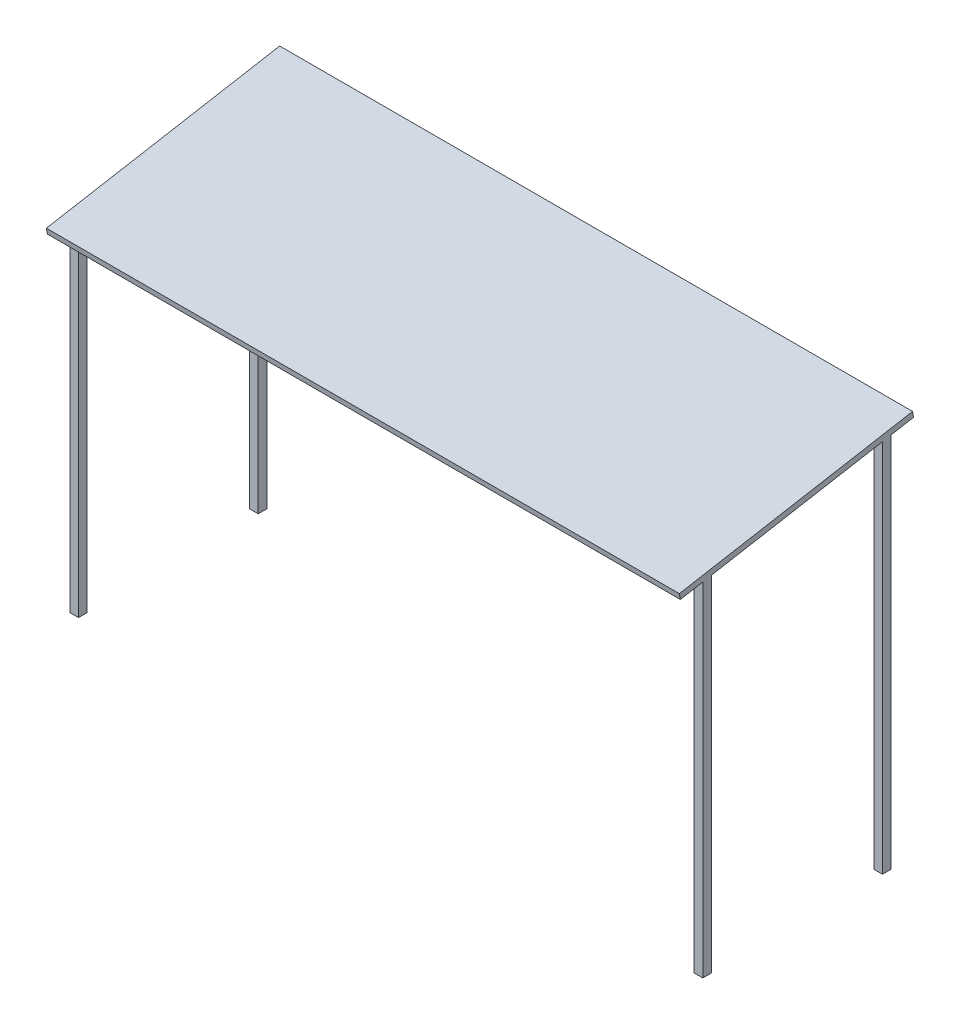
ISO-10303-21;
HEADER;
FILE_DESCRIPTION(('STEP AP214'),'2;1');
FILE_NAME('part.step','',(''),(''),'','','');
FILE_SCHEMA(('AUTOMOTIVE_DESIGN { 1 0 10303 214 1 1 1 1 }'));
ENDSEC;
DATA;
#1=APPLICATION_CONTEXT('core data for automotive mechanical design processes');
#2=APPLICATION_PROTOCOL_DEFINITION('international standard','automotive_design',2000,#1);
#3=PRODUCT_CONTEXT('',#1,'mechanical');
#4=PRODUCT('Part','Part','',(#3));
#5=PRODUCT_RELATED_PRODUCT_CATEGORY('part','',(#4));
#6=PRODUCT_DEFINITION_FORMATION('','',#4);
#7=PRODUCT_DEFINITION_CONTEXT('part definition',#1,'design');
#8=PRODUCT_DEFINITION('design','',#6,#7);
#9=PRODUCT_DEFINITION_SHAPE('','',#8);
#10=(LENGTH_UNIT() NAMED_UNIT(*) SI_UNIT(.MILLI.,.METRE.));
#11=(NAMED_UNIT(*) PLANE_ANGLE_UNIT() SI_UNIT($,.RADIAN.));
#12=(NAMED_UNIT(*) SI_UNIT($,.STERADIAN.) SOLID_ANGLE_UNIT());
#13=UNCERTAINTY_MEASURE_WITH_UNIT(LENGTH_MEASURE(1.E-05),#10,'distance_accuracy_value','');
#14=(GEOMETRIC_REPRESENTATION_CONTEXT(3) GLOBAL_UNCERTAINTY_ASSIGNED_CONTEXT((#13)) GLOBAL_UNIT_ASSIGNED_CONTEXT((#10,
#11,#12)) REPRESENTATION_CONTEXT('',''));
#15=CARTESIAN_POINT('',(0.,0.,0.));
#16=DIRECTION('',(0.,0.,1.));
#17=DIRECTION('',(1.,0.,0.));
#18=AXIS2_PLACEMENT_3D('',#15,#16,#17);
#19=CARTESIAN_POINT('',(7647.9187393404,3008.63729707734,1652.4));
#20=DIRECTION('',(0.,-0.984807753012208,-0.173648177666927));
#21=DIRECTION('',(0.,0.173648177666927,-0.984807753012209));
#22=AXIS2_PLACEMENT_3D('',#19,#20,#21);
#23=PLANE('',#22);
#24=DIRECTION('',(-1.,0.,0.));
#25=VECTOR('',#24,1.);
#26=CARTESIAN_POINT('',(0.,3008.63729707734,1652.4));
#27=LINE('',#26,#25);
#28=CARTESIAN_POINT('',(5552.4,3008.63729707734,1652.4));
#29=VERTEX_POINT('',#28);
#30=CARTESIAN_POINT('',(2.02360637091109E-13,3008.63729707734,1652.4));
#31=VERTEX_POINT('',#30);
#32=EDGE_CURVE('E202',#29,#31,#27,.T.);
#33=ORIENTED_EDGE('',*,*,#32,.F.);
#34=DIRECTION('',(0.,0.173648177666927,-0.984807753012209));
#35=VECTOR('',#34,1.);
#36=CARTESIAN_POINT('',(5552.4,3008.63729707734,1652.4));
#37=LINE('',#36,#35);
#38=CARTESIAN_POINT('',(5552.4,2973.90766154395,1849.36155060244));
#39=VERTEX_POINT('',#38);
#40=EDGE_CURVE('E275',#39,#29,#37,.T.);
#41=ORIENTED_EDGE('',*,*,#40,.F.);
#42=DIRECTION('',(-1.,0.,0.));
#43=VECTOR('',#42,1.);
#44=CARTESIAN_POINT('',(7647.9187393404,2973.90766154395,1849.36155060244));
#45=LINE('',#44,#43);
#46=CARTESIAN_POINT('',(2.26481470341147E-13,2973.90766154395,1849.36155060244));
#47=VERTEX_POINT('',#46);
#48=EDGE_CURVE('E267',#39,#47,#45,.T.);
#49=ORIENTED_EDGE('',*,*,#48,.T.);
#50=DIRECTION('',(0.,-0.173648177666927,0.984807753012208));
#51=VECTOR('',#50,1.);
#52=CARTESIAN_POINT('',(2.02360637091109E-13,3008.63729707734,1652.4));
#53=LINE('',#52,#51);
#54=EDGE_CURVE('E245',#31,#47,#53,.T.);
#55=ORIENTED_EDGE('',*,*,#54,.F.);
#56=EDGE_LOOP('',(#33,#41,#49,#55));
#57=FACE_BOUND('',#56,.T.);
#58=ADVANCED_FACE('F35',(#57),#23,.T.);
#59=CARTESIAN_POINT('',(5552.4,3022.07341300732,1576.2));
#60=VERTEX_POINT('',#59);
#61=CARTESIAN_POINT('',(5552.4,3286.56388407002,76.1999999999993));
#62=VERTEX_POINT('',#61);
#63=EDGE_CURVE('E279',#60,#62,#37,.T.);
#64=ORIENTED_EDGE('',*,*,#63,.F.);
#65=DIRECTION('',(1.,0.,0.));
#66=VECTOR('',#65,1.);
#67=CARTESIAN_POINT('',(0.,3022.07341300732,1576.2));
#68=LINE('',#67,#66);
#69=CARTESIAN_POINT('',(0.,3022.07341300732,1576.2));
#70=VERTEX_POINT('',#69);
#71=EDGE_CURVE('E195',#70,#60,#68,.T.);
#72=ORIENTED_EDGE('',*,*,#71,.F.);
#73=CARTESIAN_POINT('',(0.,3286.56388407002,76.2000000000005));
#74=VERTEX_POINT('',#73);
#75=EDGE_CURVE('E258',#74,#70,#53,.T.);
#76=ORIENTED_EDGE('',*,*,#75,.F.);
#77=DIRECTION('',(-1.,0.,0.));
#78=VECTOR('',#77,1.);
#79=CARTESIAN_POINT('',(0.,3286.56388407002,76.2));
#80=LINE('',#79,#78);
#81=EDGE_CURVE('E278',#62,#74,#80,.T.);
#82=ORIENTED_EDGE('',*,*,#81,.F.);
#83=EDGE_LOOP('',(#64,#72,#76,#82));
#84=FACE_BOUND('',#83,.T.);
#85=ADVANCED_FACE('F375',(#84),#23,.T.);
#86=CARTESIAN_POINT('',(76.2,3300.,1652.4));
#87=DIRECTION('',(-1.,0.,0.));
#88=DIRECTION('',(0.,0.,1.));
#89=AXIS2_PLACEMENT_3D('',#86,#87,#88);
#90=PLANE('',#89);
#91=DIRECTION('',(0.,0.,-1.));
#92=VECTOR('',#91,1.);
#93=CARTESIAN_POINT('',(76.2,2945.87341300732,1576.2));
#94=LINE('',#93,#92);
#95=CARTESIAN_POINT('',(76.2,2945.87341300732,1652.4));
#96=VERTEX_POINT('',#95);
#97=CARTESIAN_POINT('',(76.2,2945.87341300732,1576.2));
#98=VERTEX_POINT('',#97);
#99=EDGE_CURVE('E176',#96,#98,#94,.T.);
#100=ORIENTED_EDGE('',*,*,#99,.F.);
#101=DIRECTION('',(0.,-1.,0.));
#102=VECTOR('',#101,1.);
#103=CARTESIAN_POINT('',(76.2,3300.,1652.4));
#104=LINE('',#103,#102);
#105=CARTESIAN_POINT('',(76.2,0.,1652.4));
#106=VERTEX_POINT('',#105);
#107=EDGE_CURVE('E223',#96,#106,#104,.T.);
#108=ORIENTED_EDGE('',*,*,#107,.T.);
#109=DIRECTION('',(0.,0.,-1.));
#110=VECTOR('',#109,1.);
#111=CARTESIAN_POINT('',(76.2,0.,1652.4));
#112=LINE('',#111,#110);
#113=CARTESIAN_POINT('',(76.2,0.,1576.2));
#114=VERTEX_POINT('',#113);
#115=EDGE_CURVE('E208',#106,#114,#112,.T.);
#116=ORIENTED_EDGE('',*,*,#115,.T.);
#117=DIRECTION('',(0.,-1.,0.));
#118=VECTOR('',#117,1.);
#119=CARTESIAN_POINT('',(76.2,3300.,1576.2));
#120=LINE('',#119,#118);
#121=EDGE_CURVE('E221',#98,#114,#120,.T.);
#122=ORIENTED_EDGE('',*,*,#121,.F.);
#123=EDGE_LOOP('',(#100,#108,#116,#122));
#124=FACE_BOUND('',#123,.T.);
#125=ADVANCED_FACE('F381',(#124),#90,.F.);
#126=CARTESIAN_POINT('',(5476.2,3300.,1652.4));
#127=DIRECTION('',(1.,0.,0.));
#128=DIRECTION('',(0.,0.,-1.));
#129=AXIS2_PLACEMENT_3D('',#126,#127,#128);
#130=PLANE('',#129);
#131=DIRECTION('',(0.,0.,-1.));
#132=VECTOR('',#131,1.);
#133=CARTESIAN_POINT('',(5476.2,2945.87341300732,1576.2));
#134=LINE('',#133,#132);
#135=CARTESIAN_POINT('',(5476.2,2945.87341300732,1652.4));
#136=VERTEX_POINT('',#135);
#137=CARTESIAN_POINT('',(5476.2,2945.87341300732,1576.2));
#138=VERTEX_POINT('',#137);
#139=EDGE_CURVE('E173',#136,#138,#134,.T.);
#140=ORIENTED_EDGE('',*,*,#139,.T.);
#141=DIRECTION('',(0.,-1.,0.));
#142=VECTOR('',#141,1.);
#143=CARTESIAN_POINT('',(5476.2,3300.,1576.2));
#144=LINE('',#143,#142);
#145=CARTESIAN_POINT('',(5476.2,0.,1576.2));
#146=VERTEX_POINT('',#145);
#147=EDGE_CURVE('E184',#138,#146,#144,.T.);
#148=ORIENTED_EDGE('',*,*,#147,.T.);
#149=DIRECTION('',(0.,0.,1.));
#150=VECTOR('',#149,1.);
#151=CARTESIAN_POINT('',(5476.2,0.,1652.4));
#152=LINE('',#151,#150);
#153=CARTESIAN_POINT('',(5476.2,0.,1652.4));
#154=VERTEX_POINT('',#153);
#155=EDGE_CURVE('E350',#146,#154,#152,.T.);
#156=ORIENTED_EDGE('',*,*,#155,.T.);
#157=DIRECTION('',(0.,-1.,0.));
#158=VECTOR('',#157,1.);
#159=CARTESIAN_POINT('',(5476.2,3300.,1652.4));
#160=LINE('',#159,#158);
#161=EDGE_CURVE('E186',#136,#154,#160,.T.);
#162=ORIENTED_EDGE('',*,*,#161,.F.);
#163=EDGE_LOOP('',(#140,#148,#156,#162));
#164=FACE_BOUND('',#163,.T.);
#165=ADVANCED_FACE('F182',(#164),#130,.F.);
#166=CARTESIAN_POINT('',(5552.4,3300.,-4.44089209850063E-13));
#167=VERTEX_POINT('',#166);
#168=CARTESIAN_POINT('',(5552.4,3334.72963553339,-196.961550602443));
#169=VERTEX_POINT('',#168);
#170=EDGE_CURVE('E253',#167,#169,#37,.T.);
#171=ORIENTED_EDGE('',*,*,#170,.F.);
#172=DIRECTION('',(-1.,0.,0.));
#173=VECTOR('',#172,1.);
#174=CARTESIAN_POINT('',(0.,3300.,0.));
#175=LINE('',#174,#173);
#176=CARTESIAN_POINT('',(0.,3300.,0.));
#177=VERTEX_POINT('',#176);
#178=EDGE_CURVE('E283',#167,#177,#175,.T.);
#179=ORIENTED_EDGE('',*,*,#178,.T.);
#180=CARTESIAN_POINT('',(0.,3334.72963553339,-196.961550602442));
#181=VERTEX_POINT('',#180);
#182=EDGE_CURVE('E254',#181,#177,#53,.T.);
#183=ORIENTED_EDGE('',*,*,#182,.F.);
#184=DIRECTION('',(-1.,0.,0.));
#185=VECTOR('',#184,1.);
#186=CARTESIAN_POINT('',(7647.9187393404,3334.72963553339,-196.961550602443));
#187=LINE('',#186,#185);
#188=EDGE_CURVE('E249',#169,#181,#187,.T.);
#189=ORIENTED_EDGE('',*,*,#188,.F.);
#190=EDGE_LOOP('',(#171,#179,#183,#189));
#191=FACE_BOUND('',#190,.T.);
#192=ADVANCED_FACE('F323',(#191),#23,.T.);
#193=CARTESIAN_POINT('',(0.,3300.,0.));
#194=DIRECTION('',(1.,0.,0.));
#195=DIRECTION('',(0.,0.,-1.));
#196=AXIS2_PLACEMENT_3D('',#193,#194,#195);
#197=PLANE('',#196);
#198=DIRECTION('',(0.,-1.,0.));
#199=VECTOR('',#198,1.);
#200=CARTESIAN_POINT('',(0.,3300.,76.2));
#201=LINE('',#200,#199);
#202=CARTESIAN_POINT('',(0.,0.,76.2));
#203=VERTEX_POINT('',#202);
#204=EDGE_CURVE('E11',#74,#203,#201,.T.);
#205=ORIENTED_EDGE('',*,*,#204,.F.);
#206=ORIENTED_EDGE('',*,*,#75,.T.);
#207=DIRECTION('',(0.,-1.,0.));
#208=VECTOR('',#207,1.);
#209=CARTESIAN_POINT('',(0.,3300.,1576.2));
#210=LINE('',#209,#208);
#211=CARTESIAN_POINT('',(0.,0.,1576.2));
#212=VERTEX_POINT('',#211);
#213=EDGE_CURVE('E219',#70,#212,#210,.T.);
#214=ORIENTED_EDGE('',*,*,#213,.T.);
#215=DIRECTION('',(0.,0.,1.));
#216=VECTOR('',#215,1.);
#217=CARTESIAN_POINT('',(0.,0.,1652.4));
#218=LINE('',#217,#216);
#219=CARTESIAN_POINT('',(0.,0.,1652.4));
#220=VERTEX_POINT('',#219);
#221=EDGE_CURVE('E214',#212,#220,#218,.T.);
#222=ORIENTED_EDGE('',*,*,#221,.T.);
#223=DIRECTION('',(0.,-1.,0.));
#224=VECTOR('',#223,1.);
#225=CARTESIAN_POINT('',(0.,3300.,1652.4));
#226=LINE('',#225,#224);
#227=EDGE_CURVE('E217',#31,#220,#226,.T.);
#228=ORIENTED_EDGE('',*,*,#227,.F.);
#229=ORIENTED_EDGE('',*,*,#54,.T.);
#230=DIRECTION('',(0.,0.984807753012208,0.173648177666927));
#231=VECTOR('',#230,1.);
#232=CARTESIAN_POINT('',(2.26481470341147E-13,2973.90766154395,1849.36155060244));
#233=LINE('',#232,#231);
#234=CARTESIAN_POINT('',(2.27544758765935E-13,3023.14804919456,1858.04395948579));
#235=VERTEX_POINT('',#234);
#236=EDGE_CURVE('E257',#47,#235,#233,.T.);
#237=ORIENTED_EDGE('',*,*,#236,.T.);
#238=DIRECTION('',(0.,0.173648177666927,-0.984807753012209));
#239=VECTOR('',#238,1.);
#240=CARTESIAN_POINT('',(0.,3349.24038765061,8.68240888334636));
#241=LINE('',#240,#239);
#242=CARTESIAN_POINT('',(0.,3383.970023184,-188.279141719095));
#243=VERTEX_POINT('',#242);
#244=EDGE_CURVE('E261',#235,#243,#241,.T.);
#245=ORIENTED_EDGE('',*,*,#244,.T.);
#246=DIRECTION('',(0.,-0.984807753012209,-0.173648177666926));
#247=VECTOR('',#246,1.);
#248=CARTESIAN_POINT('',(0.,3334.72963553339,-196.961550602442));
#249=LINE('',#248,#247);
#250=EDGE_CURVE('E264',#243,#181,#249,.T.);
#251=ORIENTED_EDGE('',*,*,#250,.T.);
#252=ORIENTED_EDGE('',*,*,#182,.T.);
#253=DIRECTION('',(0.,-1.,0.));
#254=VECTOR('',#253,1.);
#255=CARTESIAN_POINT('',(0.,3300.,0.));
#256=LINE('',#255,#254);
#257=CARTESIAN_POINT('',(0.,0.,0.));
#258=VERTEX_POINT('',#257);
#259=EDGE_CURVE('E286',#177,#258,#256,.T.);
#260=ORIENTED_EDGE('',*,*,#259,.T.);
#261=DIRECTION('',(0.,0.,1.));
#262=VECTOR('',#261,1.);
#263=CARTESIAN_POINT('',(0.,0.,0.));
#264=LINE('',#263,#262);
#265=EDGE_CURVE('E282',#258,#203,#264,.T.);
#266=ORIENTED_EDGE('',*,*,#265,.T.);
#267=EDGE_LOOP('',(#205,#206,#214,#222,#228,#229,#237,#245,#251,#252,#260,#266));
#268=FACE_BOUND('',#267,.T.);
#269=ADVANCED_FACE('F37',(#268),#197,.F.);
#270=CARTESIAN_POINT('',(0.,3300.,76.2));
#271=DIRECTION('',(0.,0.,-1.));
#272=DIRECTION('',(-1.,0.,0.));
#273=AXIS2_PLACEMENT_3D('',#270,#271,#272);
#274=PLANE('',#273);
#275=DIRECTION('',(0.,-1.,0.));
#276=VECTOR('',#275,1.);
#277=CARTESIAN_POINT('',(76.2,3300.,76.2));
#278=LINE('',#277,#276);
#279=CARTESIAN_POINT('',(76.2,3223.8,76.2));
#280=VERTEX_POINT('',#279);
#281=CARTESIAN_POINT('',(76.2,0.,76.2));
#282=VERTEX_POINT('',#281);
#283=EDGE_CURVE('E43',#280,#282,#278,.T.);
#284=ORIENTED_EDGE('',*,*,#283,.F.);
#285=DIRECTION('',(1.,0.,0.));
#286=VECTOR('',#285,1.);
#287=CARTESIAN_POINT('',(5476.2,3223.8,76.1999999999992));
#288=LINE('',#287,#286);
#289=CARTESIAN_POINT('',(5476.2,3223.8,76.1999999999993));
#290=VERTEX_POINT('',#289);
#291=EDGE_CURVE('E341',#280,#290,#288,.T.);
#292=ORIENTED_EDGE('',*,*,#291,.T.);
#293=DIRECTION('',(0.,-1.,0.));
#294=VECTOR('',#293,1.);
#295=CARTESIAN_POINT('',(5476.2,3300.,76.1999999999993));
#296=LINE('',#295,#294);
#297=CARTESIAN_POINT('',(5476.2,0.,76.1999999999993));
#298=VERTEX_POINT('',#297);
#299=EDGE_CURVE('E241',#290,#298,#296,.T.);
#300=ORIENTED_EDGE('',*,*,#299,.T.);
#301=DIRECTION('',(1.,0.,0.));
#302=VECTOR('',#301,1.);
#303=CARTESIAN_POINT('',(5552.4,0.,76.1999999999993));
#304=LINE('',#303,#302);
#305=CARTESIAN_POINT('',(5552.4,0.,76.1999999999993));
#306=VERTEX_POINT('',#305);
#307=EDGE_CURVE('E231',#298,#306,#304,.T.);
#308=ORIENTED_EDGE('',*,*,#307,.T.);
#309=DIRECTION('',(0.,-1.,0.));
#310=VECTOR('',#309,1.);
#311=CARTESIAN_POINT('',(5552.4,3300.,76.1999999999993));
#312=LINE('',#311,#310);
#313=EDGE_CURVE('E239',#62,#306,#312,.T.);
#314=ORIENTED_EDGE('',*,*,#313,.F.);
#315=ORIENTED_EDGE('',*,*,#81,.T.);
#316=ORIENTED_EDGE('',*,*,#204,.T.);
#317=DIRECTION('',(1.,0.,0.));
#318=VECTOR('',#317,1.);
#319=CARTESIAN_POINT('',(0.,0.,76.2));
#320=LINE('',#319,#318);
#321=EDGE_CURVE('E290',#203,#282,#320,.T.);
#322=ORIENTED_EDGE('',*,*,#321,.T.);
#323=EDGE_LOOP('',(#284,#292,#300,#308,#314,#315,#316,#322));
#324=FACE_BOUND('',#323,.T.);
#325=ADVANCED_FACE('F310',(#324),#274,.F.);
#326=CARTESIAN_POINT('',(76.2,3300.,0.));
#327=DIRECTION('',(-1.,0.,0.));
#328=DIRECTION('',(0.,0.,1.));
#329=AXIS2_PLACEMENT_3D('',#326,#327,#328);
#330=PLANE('',#329);
#331=DIRECTION('',(0.,-1.,0.));
#332=VECTOR('',#331,1.);
#333=CARTESIAN_POINT('',(76.2,3300.,0.));
#334=LINE('',#333,#332);
#335=CARTESIAN_POINT('',(76.2,3223.8,0.));
#336=VERTEX_POINT('',#335);
#337=CARTESIAN_POINT('',(76.2,0.,0.));
#338=VERTEX_POINT('',#337);
#339=EDGE_CURVE('E299',#336,#338,#334,.T.);
#340=ORIENTED_EDGE('',*,*,#339,.F.);
#341=DIRECTION('',(0.,0.,-1.));
#342=VECTOR('',#341,1.);
#343=CARTESIAN_POINT('',(76.2,3223.8,5476.73760657215));
#344=LINE('',#343,#342);
#345=EDGE_CURVE('E307',#280,#336,#344,.T.);
#346=ORIENTED_EDGE('',*,*,#345,.F.);
#347=ORIENTED_EDGE('',*,*,#283,.T.);
#348=DIRECTION('',(0.,0.,-1.));
#349=VECTOR('',#348,1.);
#350=CARTESIAN_POINT('',(76.2,0.,0.));
#351=LINE('',#350,#349);
#352=EDGE_CURVE('E293',#282,#338,#351,.T.);
#353=ORIENTED_EDGE('',*,*,#352,.T.);
#354=EDGE_LOOP('',(#340,#346,#347,#353));
#355=FACE_BOUND('',#354,.T.);
#356=ADVANCED_FACE('F304',(#355),#330,.F.);
#357=CARTESIAN_POINT('',(0.,3300.,0.));
#358=DIRECTION('',(0.,0.,1.));
#359=DIRECTION('',(1.,0.,0.));
#360=AXIS2_PLACEMENT_3D('',#357,#358,#359);
#361=PLANE('',#360);
#362=DIRECTION('',(-1.,0.,0.));
#363=VECTOR('',#362,1.);
#364=CARTESIAN_POINT('',(0.,0.,0.));
#365=LINE('',#364,#363);
#366=EDGE_CURVE('E287',#338,#258,#365,.T.);
#367=ORIENTED_EDGE('',*,*,#366,.T.);
#368=ORIENTED_EDGE('',*,*,#259,.F.);
#369=ORIENTED_EDGE('',*,*,#178,.F.);
#370=DIRECTION('',(0.,-1.,0.));
#371=VECTOR('',#370,1.);
#372=CARTESIAN_POINT('',(5552.4,3300.,-6.79972888758576E-13));
#373=LINE('',#372,#371);
#374=CARTESIAN_POINT('',(5552.4,0.,-6.79972888758576E-13));
#375=VERTEX_POINT('',#374);
#376=EDGE_CURVE('E236',#167,#375,#373,.T.);
#377=ORIENTED_EDGE('',*,*,#376,.T.);
#378=DIRECTION('',(-1.,0.,0.));
#379=VECTOR('',#378,1.);
#380=CARTESIAN_POINT('',(5552.4,0.,-6.79972888758576E-13));
#381=LINE('',#380,#379);
#382=CARTESIAN_POINT('',(5476.2,0.,-6.61309271539571E-13));
#383=VERTEX_POINT('',#382);
#384=EDGE_CURVE('E225',#375,#383,#381,.T.);
#385=ORIENTED_EDGE('',*,*,#384,.T.);
#386=DIRECTION('',(0.,-1.,0.));
#387=VECTOR('',#386,1.);
#388=CARTESIAN_POINT('',(5476.2,3300.,-6.61309271539571E-13));
#389=LINE('',#388,#387);
#390=CARTESIAN_POINT('',(5476.2,3223.8,0.));
#391=VERTEX_POINT('',#390);
#392=EDGE_CURVE('E243',#391,#383,#389,.T.);
#393=ORIENTED_EDGE('',*,*,#392,.F.);
#394=DIRECTION('',(-1.,0.,0.));
#395=VECTOR('',#394,1.);
#396=CARTESIAN_POINT('',(5476.2,3223.8,0.));
#397=LINE('',#396,#395);
#398=EDGE_CURVE('E187',#391,#336,#397,.T.);
#399=ORIENTED_EDGE('',*,*,#398,.T.);
#400=ORIENTED_EDGE('',*,*,#339,.T.);
#401=EDGE_LOOP('',(#367,#368,#369,#377,#385,#393,#399,#400));
#402=FACE_BOUND('',#401,.T.);
#403=ADVANCED_FACE('F315',(#402),#361,.F.);
#404=CARTESIAN_POINT('',(0.,0.,0.));
#405=DIRECTION('',(0.,1.,0.));
#406=DIRECTION('',(0.,0.,1.));
#407=AXIS2_PLACEMENT_3D('',#404,#405,#406);
#408=PLANE('',#407);
#409=ORIENTED_EDGE('',*,*,#265,.F.);
#410=ORIENTED_EDGE('',*,*,#366,.F.);
#411=ORIENTED_EDGE('',*,*,#352,.F.);
#412=ORIENTED_EDGE('',*,*,#321,.F.);
#413=EDGE_LOOP('',(#409,#410,#411,#412));
#414=FACE_BOUND('',#413,.T.);
#415=ADVANCED_FACE('F313',(#414),#408,.F.);
#416=CARTESIAN_POINT('',(7647.9187393404,3334.72963553339,-196.961550602443));
#417=DIRECTION('',(0.,0.173648177666926,-0.984807753012209));
#418=DIRECTION('',(0.,0.984807753012209,0.173648177666926));
#419=AXIS2_PLACEMENT_3D('',#416,#417,#418);
#420=PLANE('',#419);
#421=DIRECTION('',(0.,0.984807753012209,0.173648177666926));
#422=VECTOR('',#421,1.);
#423=CARTESIAN_POINT('',(5552.4,3334.72963553339,-196.961550602442));
#424=LINE('',#423,#422);
#425=CARTESIAN_POINT('',(5552.4,3383.970023184,-188.279141719096));
#426=VERTEX_POINT('',#425);
#427=EDGE_CURVE('E251',#169,#426,#424,.T.);
#428=ORIENTED_EDGE('',*,*,#427,.F.);
#429=ORIENTED_EDGE('',*,*,#188,.T.);
#430=ORIENTED_EDGE('',*,*,#250,.F.);
#431=DIRECTION('',(-1.,0.,0.));
#432=VECTOR('',#431,1.);
#433=CARTESIAN_POINT('',(7647.9187393404,3383.970023184,-188.279141719096));
#434=LINE('',#433,#432);
#435=EDGE_CURVE('E269',#426,#243,#434,.T.);
#436=ORIENTED_EDGE('',*,*,#435,.F.);
#437=EDGE_LOOP('',(#428,#429,#430,#436));
#438=FACE_BOUND('',#437,.T.);
#439=ADVANCED_FACE('F407',(#438),#420,.T.);
#440=CARTESIAN_POINT('',(7647.9187393404,3349.24038765061,8.68240888334542));
#441=DIRECTION('',(0.,0.984807753012209,0.173648177666927));
#442=DIRECTION('',(0.,-0.173648177666927,0.984807753012209));
#443=AXIS2_PLACEMENT_3D('',#440,#441,#442);
#444=PLANE('',#443);
#445=DIRECTION('',(0.,-0.173648177666927,0.984807753012209));
#446=VECTOR('',#445,1.);
#447=CARTESIAN_POINT('',(5552.4,3349.24038765061,8.68240888334543));
#448=LINE('',#447,#446);
#449=CARTESIAN_POINT('',(5552.4,3023.14804919456,1858.04395948579));
#450=VERTEX_POINT('',#449);
#451=EDGE_CURVE('E248',#426,#450,#448,.T.);
#452=ORIENTED_EDGE('',*,*,#451,.F.);
#453=ORIENTED_EDGE('',*,*,#435,.T.);
#454=ORIENTED_EDGE('',*,*,#244,.F.);
#455=DIRECTION('',(-1.,0.,0.));
#456=VECTOR('',#455,1.);
#457=CARTESIAN_POINT('',(7647.9187393404,3023.14804919456,1858.04395948579));
#458=LINE('',#457,#456);
#459=EDGE_CURVE('E271',#450,#235,#458,.T.);
#460=ORIENTED_EDGE('',*,*,#459,.F.);
#461=EDGE_LOOP('',(#452,#453,#454,#460));
#462=FACE_BOUND('',#461,.T.);
#463=ADVANCED_FACE('F410',(#462),#444,.T.);
#464=CARTESIAN_POINT('',(7647.9187393404,2973.90766154395,1849.36155060244));
#465=DIRECTION('',(0.,-0.173648177666927,0.984807753012208));
#466=DIRECTION('',(0.,-0.984807753012209,-0.173648177666927));
#467=AXIS2_PLACEMENT_3D('',#464,#465,#466);
#468=PLANE('',#467);
#469=DIRECTION('',(0.,-0.984807753012209,-0.173648177666927));
#470=VECTOR('',#469,1.);
#471=CARTESIAN_POINT('',(5552.4,2973.90766154395,1849.36155060244));
#472=LINE('',#471,#470);
#473=EDGE_CURVE('E246',#450,#39,#472,.T.);
#474=ORIENTED_EDGE('',*,*,#473,.F.);
#475=ORIENTED_EDGE('',*,*,#459,.T.);
#476=ORIENTED_EDGE('',*,*,#236,.F.);
#477=ORIENTED_EDGE('',*,*,#48,.F.);
#478=EDGE_LOOP('',(#474,#475,#476,#477));
#479=FACE_BOUND('',#478,.T.);
#480=ADVANCED_FACE('F406',(#479),#468,.T.);
#481=CARTESIAN_POINT('',(5552.4,3300.,-6.79972888758576E-13));
#482=DIRECTION('',(-1.,0.,0.));
#483=DIRECTION('',(0.,0.,1.));
#484=AXIS2_PLACEMENT_3D('',#481,#482,#483);
#485=PLANE('',#484);
#486=ORIENTED_EDGE('',*,*,#427,.T.);
#487=ORIENTED_EDGE('',*,*,#451,.T.);
#488=ORIENTED_EDGE('',*,*,#473,.T.);
#489=ORIENTED_EDGE('',*,*,#40,.T.);
#490=DIRECTION('',(0.,-1.,0.));
#491=VECTOR('',#490,1.);
#492=CARTESIAN_POINT('',(5552.4,3300.,1652.4));
#493=LINE('',#492,#491);
#494=CARTESIAN_POINT('',(5552.4,0.,1652.4));
#495=VERTEX_POINT('',#494);
#496=EDGE_CURVE('E197',#29,#495,#493,.T.);
#497=ORIENTED_EDGE('',*,*,#496,.T.);
#498=DIRECTION('',(0.,0.,-1.));
#499=VECTOR('',#498,1.);
#500=CARTESIAN_POINT('',(5552.4,0.,1652.4));
#501=LINE('',#500,#499);
#502=CARTESIAN_POINT('',(5552.4,0.,1576.2));
#503=VERTEX_POINT('',#502);
#504=EDGE_CURVE('E346',#495,#503,#501,.T.);
#505=ORIENTED_EDGE('',*,*,#504,.T.);
#506=DIRECTION('',(0.,-1.,0.));
#507=VECTOR('',#506,1.);
#508=CARTESIAN_POINT('',(5552.4,3300.,1576.2));
#509=LINE('',#508,#507);
#510=EDGE_CURVE('E193',#60,#503,#509,.T.);
#511=ORIENTED_EDGE('',*,*,#510,.F.);
#512=ORIENTED_EDGE('',*,*,#63,.T.);
#513=ORIENTED_EDGE('',*,*,#313,.T.);
#514=DIRECTION('',(0.,0.,-1.));
#515=VECTOR('',#514,1.);
#516=CARTESIAN_POINT('',(5552.4,0.,-6.79972888758576E-13));
#517=LINE('',#516,#515);
#518=EDGE_CURVE('E234',#306,#375,#517,.T.);
#519=ORIENTED_EDGE('',*,*,#518,.T.);
#520=ORIENTED_EDGE('',*,*,#376,.F.);
#521=ORIENTED_EDGE('',*,*,#170,.T.);
#522=EDGE_LOOP('',(#486,#487,#488,#489,#497,#505,#511,#512,#513,#519,#520,#521));
#523=FACE_BOUND('',#522,.T.);
#524=ADVANCED_FACE('F327',(#523),#485,.F.);
#525=CARTESIAN_POINT('',(5476.2,3300.,-6.61309271539571E-13));
#526=DIRECTION('',(1.,0.,0.));
#527=DIRECTION('',(0.,0.,-1.));
#528=AXIS2_PLACEMENT_3D('',#525,#526,#527);
#529=PLANE('',#528);
#530=ORIENTED_EDGE('',*,*,#299,.F.);
#531=DIRECTION('',(0.,0.,-1.));
#532=VECTOR('',#531,1.);
#533=CARTESIAN_POINT('',(5476.2,3223.8,5476.73760657215));
#534=LINE('',#533,#532);
#535=EDGE_CURVE('E58',#290,#391,#534,.T.);
#536=ORIENTED_EDGE('',*,*,#535,.T.);
#537=ORIENTED_EDGE('',*,*,#392,.T.);
#538=DIRECTION('',(0.,0.,1.));
#539=VECTOR('',#538,1.);
#540=CARTESIAN_POINT('',(5476.2,0.,-6.61309271539571E-13));
#541=LINE('',#540,#539);
#542=EDGE_CURVE('E228',#383,#298,#541,.T.);
#543=ORIENTED_EDGE('',*,*,#542,.T.);
#544=EDGE_LOOP('',(#530,#536,#537,#543));
#545=FACE_BOUND('',#544,.T.);
#546=ADVANCED_FACE('F339',(#545),#529,.F.);
#547=CARTESIAN_POINT('',(0.,0.,0.));
#548=DIRECTION('',(0.,1.,0.));
#549=DIRECTION('',(0.,0.,1.));
#550=AXIS2_PLACEMENT_3D('',#547,#548,#549);
#551=PLANE('',#550);
#552=ORIENTED_EDGE('',*,*,#384,.F.);
#553=ORIENTED_EDGE('',*,*,#518,.F.);
#554=ORIENTED_EDGE('',*,*,#307,.F.);
#555=ORIENTED_EDGE('',*,*,#542,.F.);
#556=EDGE_LOOP('',(#552,#553,#554,#555));
#557=FACE_BOUND('',#556,.T.);
#558=ADVANCED_FACE('F334',(#557),#551,.F.);
#559=CARTESIAN_POINT('',(0.,3300.,1652.4));
#560=DIRECTION('',(0.,0.,-1.));
#561=DIRECTION('',(-1.,0.,0.));
#562=AXIS2_PLACEMENT_3D('',#559,#560,#561);
#563=PLANE('',#562);
#564=ORIENTED_EDGE('',*,*,#107,.F.);
#565=DIRECTION('',(-1.,0.,0.));
#566=VECTOR('',#565,1.);
#567=CARTESIAN_POINT('',(5583.96307345283,2945.87341300732,1652.4));
#568=LINE('',#567,#566);
#569=EDGE_CURVE('E50',#136,#96,#568,.T.);
#570=ORIENTED_EDGE('',*,*,#569,.F.);
#571=ORIENTED_EDGE('',*,*,#161,.T.);
#572=DIRECTION('',(1.,0.,0.));
#573=VECTOR('',#572,1.);
#574=CARTESIAN_POINT('',(5552.4,0.,1652.4));
#575=LINE('',#574,#573);
#576=EDGE_CURVE('E352',#154,#495,#575,.T.);
#577=ORIENTED_EDGE('',*,*,#576,.T.);
#578=ORIENTED_EDGE('',*,*,#496,.F.);
#579=ORIENTED_EDGE('',*,*,#32,.T.);
#580=ORIENTED_EDGE('',*,*,#227,.T.);
#581=DIRECTION('',(1.,0.,0.));
#582=VECTOR('',#581,1.);
#583=CARTESIAN_POINT('',(0.,0.,1652.4));
#584=LINE('',#583,#582);
#585=EDGE_CURVE('E205',#220,#106,#584,.T.);
#586=ORIENTED_EDGE('',*,*,#585,.T.);
#587=EDGE_LOOP('',(#564,#570,#571,#577,#578,#579,#580,#586));
#588=FACE_BOUND('',#587,.T.);
#589=ADVANCED_FACE('F359',(#588),#563,.F.);
#590=CARTESIAN_POINT('',(0.,3300.,1576.2));
#591=DIRECTION('',(0.,0.,1.));
#592=DIRECTION('',(1.,0.,0.));
#593=AXIS2_PLACEMENT_3D('',#590,#591,#592);
#594=PLANE('',#593);
#595=ORIENTED_EDGE('',*,*,#213,.F.);
#596=ORIENTED_EDGE('',*,*,#71,.T.);
#597=ORIENTED_EDGE('',*,*,#510,.T.);
#598=DIRECTION('',(-1.,0.,0.));
#599=VECTOR('',#598,1.);
#600=CARTESIAN_POINT('',(5552.4,0.,1576.2));
#601=LINE('',#600,#599);
#602=EDGE_CURVE('E191',#503,#146,#601,.T.);
#603=ORIENTED_EDGE('',*,*,#602,.T.);
#604=ORIENTED_EDGE('',*,*,#147,.F.);
#605=DIRECTION('',(-1.,0.,0.));
#606=VECTOR('',#605,1.);
#607=CARTESIAN_POINT('',(5583.96307345283,2945.87341300732,1576.2));
#608=LINE('',#607,#606);
#609=EDGE_CURVE('E170',#138,#98,#608,.T.);
#610=ORIENTED_EDGE('',*,*,#609,.T.);
#611=ORIENTED_EDGE('',*,*,#121,.T.);
#612=DIRECTION('',(-1.,0.,0.));
#613=VECTOR('',#612,1.);
#614=CARTESIAN_POINT('',(0.,0.,1576.2));
#615=LINE('',#614,#613);
#616=EDGE_CURVE('E211',#114,#212,#615,.T.);
#617=ORIENTED_EDGE('',*,*,#616,.T.);
#618=EDGE_LOOP('',(#595,#596,#597,#603,#604,#610,#611,#617));
#619=FACE_BOUND('',#618,.T.);
#620=ADVANCED_FACE('F189',(#619),#594,.F.);
#621=CARTESIAN_POINT('',(0.,0.,0.));
#622=DIRECTION('',(0.,1.,0.));
#623=DIRECTION('',(0.,0.,1.));
#624=AXIS2_PLACEMENT_3D('',#621,#622,#623);
#625=PLANE('',#624);
#626=ORIENTED_EDGE('',*,*,#585,.F.);
#627=ORIENTED_EDGE('',*,*,#221,.F.);
#628=ORIENTED_EDGE('',*,*,#616,.F.);
#629=ORIENTED_EDGE('',*,*,#115,.F.);
#630=EDGE_LOOP('',(#626,#627,#628,#629));
#631=FACE_BOUND('',#630,.T.);
#632=ADVANCED_FACE('F364',(#631),#625,.F.);
#633=CARTESIAN_POINT('',(0.,0.,0.));
#634=DIRECTION('',(0.,1.,0.));
#635=DIRECTION('',(0.,0.,1.));
#636=AXIS2_PLACEMENT_3D('',#633,#634,#635);
#637=PLANE('',#636);
#638=ORIENTED_EDGE('',*,*,#504,.F.);
#639=ORIENTED_EDGE('',*,*,#576,.F.);
#640=ORIENTED_EDGE('',*,*,#155,.F.);
#641=ORIENTED_EDGE('',*,*,#602,.F.);
#642=EDGE_LOOP('',(#638,#639,#640,#641));
#643=FACE_BOUND('',#642,.T.);
#644=ADVANCED_FACE('F361',(#643),#637,.F.);
#645=CARTESIAN_POINT('',(5476.2,3223.8,5476.73760657215));
#646=DIRECTION('',(0.,-1.,0.));
#647=DIRECTION('',(0.,0.,-1.));
#648=AXIS2_PLACEMENT_3D('',#645,#646,#647);
#649=PLANE('',#648);
#650=ORIENTED_EDGE('',*,*,#291,.F.);
#651=ORIENTED_EDGE('',*,*,#345,.T.);
#652=ORIENTED_EDGE('',*,*,#398,.F.);
#653=ORIENTED_EDGE('',*,*,#535,.F.);
#654=EDGE_LOOP('',(#650,#651,#652,#653));
#655=FACE_BOUND('',#654,.T.);
#656=ADVANCED_FACE('F363',(#655),#649,.T.);
#657=CARTESIAN_POINT('',(5583.96307345283,2945.87341300732,1576.2));
#658=DIRECTION('',(0.,1.,0.));
#659=DIRECTION('',(0.,0.,1.));
#660=AXIS2_PLACEMENT_3D('',#657,#658,#659);
#661=PLANE('',#660);
#662=ORIENTED_EDGE('',*,*,#139,.F.);
#663=ORIENTED_EDGE('',*,*,#569,.T.);
#664=ORIENTED_EDGE('',*,*,#99,.T.);
#665=ORIENTED_EDGE('',*,*,#609,.F.);
#666=EDGE_LOOP('',(#662,#663,#664,#665));
#667=FACE_BOUND('',#666,.T.);
#668=ADVANCED_FACE('F172',(#667),#661,.F.);
#669=CLOSED_SHELL('',(#58,#85,#125,#165,#192,#269,#325,#356,#403,#415,#439,#463,#480,#524,#546,
#558,#589,#620,#632,#644,#656,#668));
#670=MANIFOLD_SOLID_BREP('B2',#669);
#671=ADVANCED_BREP_SHAPE_REPRESENTATION('',(#18,#670),#14);
#672=SHAPE_DEFINITION_REPRESENTATION(#9,#671);
ENDSEC;
END-ISO-10303-21;
